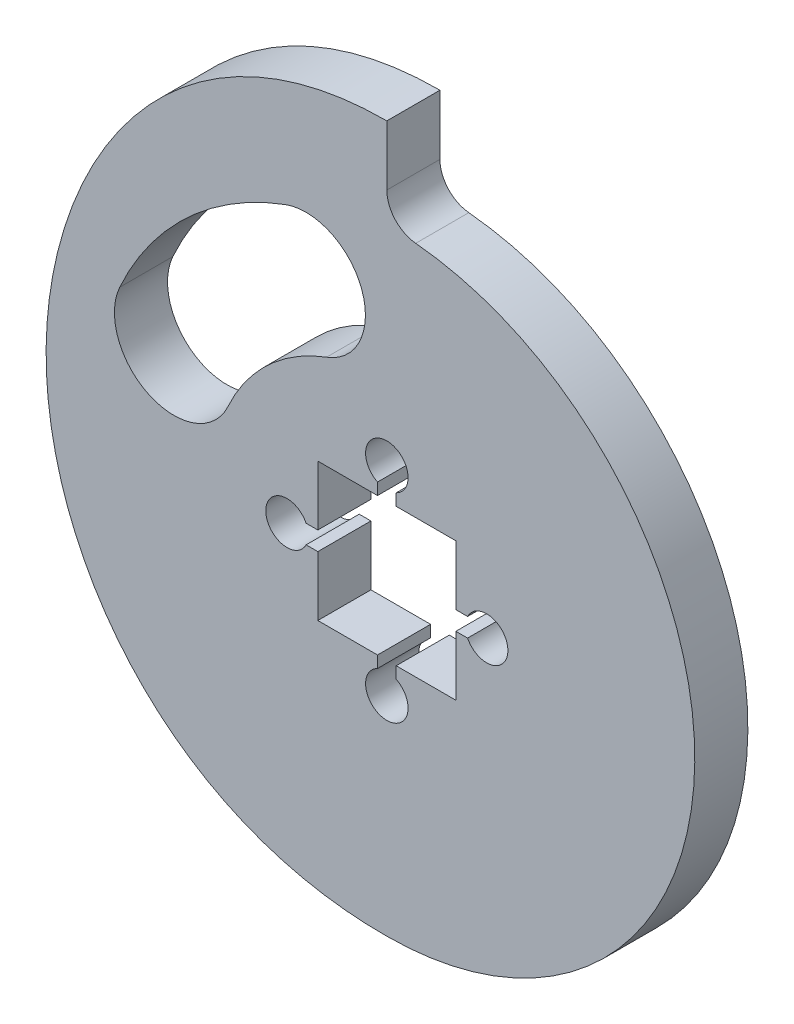
ISO-10303-21;
HEADER;
FILE_DESCRIPTION(('STEP AP214'),'2;1');
FILE_NAME('part.step','',(''),(''),'','','');
FILE_SCHEMA(('AUTOMOTIVE_DESIGN { 1 0 10303 214 1 1 1 1 }'));
ENDSEC;
DATA;
#1=APPLICATION_CONTEXT('core data for automotive mechanical design processes');
#2=APPLICATION_PROTOCOL_DEFINITION('international standard','automotive_design',2000,#1);
#3=PRODUCT_CONTEXT('',#1,'mechanical');
#4=PRODUCT('Part','Part','',(#3));
#5=PRODUCT_RELATED_PRODUCT_CATEGORY('part','',(#4));
#6=PRODUCT_DEFINITION_FORMATION('','',#4);
#7=PRODUCT_DEFINITION_CONTEXT('part definition',#1,'design');
#8=PRODUCT_DEFINITION('design','',#6,#7);
#9=PRODUCT_DEFINITION_SHAPE('','',#8);
#10=(LENGTH_UNIT() NAMED_UNIT(*) SI_UNIT(.MILLI.,.METRE.));
#11=(NAMED_UNIT(*) PLANE_ANGLE_UNIT() SI_UNIT($,.RADIAN.));
#12=(NAMED_UNIT(*) SI_UNIT($,.STERADIAN.) SOLID_ANGLE_UNIT());
#13=UNCERTAINTY_MEASURE_WITH_UNIT(LENGTH_MEASURE(1.E-05),#10,'distance_accuracy_value','');
#14=(GEOMETRIC_REPRESENTATION_CONTEXT(3) GLOBAL_UNCERTAINTY_ASSIGNED_CONTEXT((#13)) GLOBAL_UNIT_ASSIGNED_CONTEXT((#10,
#11,#12)) REPRESENTATION_CONTEXT('',''));
#15=CARTESIAN_POINT('',(0.,0.,0.));
#16=DIRECTION('',(0.,0.,1.));
#17=DIRECTION('',(1.,0.,0.));
#18=AXIS2_PLACEMENT_3D('',#15,#16,#17);
#19=CARTESIAN_POINT('',(0.,0.,6.35));
#20=DIRECTION('',(1.,0.,0.));
#21=DIRECTION('',(0.,1.,0.));
#22=AXIS2_PLACEMENT_3D('',#19,#20,#21);
#23=PLANE('',#22);
#24=DIRECTION('',(0.,-1.,0.));
#25=VECTOR('',#24,1.);
#26=CARTESIAN_POINT('',(0.,0.,6.35));
#27=LINE('',#26,#25);
#28=CARTESIAN_POINT('',(0.,47.625,6.35));
#29=VERTEX_POINT('',#28);
#30=CARTESIAN_POINT('',(0.,40.4610120980679,6.35));
#31=VERTEX_POINT('',#30);
#32=EDGE_CURVE('E323',#29,#31,#27,.T.);
#33=ORIENTED_EDGE('',*,*,#32,.T.);
#34=DIRECTION('',(0.,0.,-1.));
#35=VECTOR('',#34,1.);
#36=CARTESIAN_POINT('',(0.,40.4610120980679,6.35));
#37=LINE('',#36,#35);
#38=CARTESIAN_POINT('',(0.,40.4610120980679,0.));
#39=VERTEX_POINT('',#38);
#40=EDGE_CURVE('E506',#31,#39,#37,.T.);
#41=ORIENTED_EDGE('',*,*,#40,.T.);
#42=DIRECTION('',(0.,-1.,0.));
#43=VECTOR('',#42,1.);
#44=CARTESIAN_POINT('',(0.,0.,0.));
#45=LINE('',#44,#43);
#46=CARTESIAN_POINT('',(0.,47.625,0.));
#47=VERTEX_POINT('',#46);
#48=EDGE_CURVE('E490',#47,#39,#45,.T.);
#49=ORIENTED_EDGE('',*,*,#48,.F.);
#50=DIRECTION('',(0.,0.,-1.));
#51=VECTOR('',#50,1.);
#52=CARTESIAN_POINT('',(0.,47.625,6.35));
#53=LINE('',#52,#51);
#54=EDGE_CURVE('E504',#29,#47,#53,.T.);
#55=ORIENTED_EDGE('',*,*,#54,.F.);
#56=EDGE_LOOP('',(#33,#41,#49,#55));
#57=FACE_BOUND('',#56,.T.);
#58=ADVANCED_FACE('F43',(#57),#23,.T.);
#59=CARTESIAN_POINT('',(0.,47.625,6.35));
#60=CARTESIAN_POINT('',(-26.6001532489373,47.625,6.35));
#61=CARTESIAN_POINT('',(-56.1496420569065,-0.404637175168933,6.35));
#62=CARTESIAN_POINT('',(-24.155195679516,-36.9840787872397,6.35));
#63=CARTESIAN_POINT('',(0.,-36.83,6.35));
#64=B_SPLINE_CURVE_WITH_KNOTS('',3,(#59,#60,#61,#62,#63),.UNSPECIFIED.,.F.,.F.,(4,1,4),(0.,
0.529165326863951,1.),.UNSPECIFIED.);
#65=DIRECTION('',(0.,0.,-1.));
#66=VECTOR('',#65,1.);
#67=SURFACE_OF_LINEAR_EXTRUSION('',#64,#66);
#68=CARTESIAN_POINT('',(0.,47.625,0.));
#69=CARTESIAN_POINT('',(-26.6001532489373,47.625,0.));
#70=CARTESIAN_POINT('',(-56.1496420569065,-0.404637175168933,0.));
#71=CARTESIAN_POINT('',(-24.155195679516,-36.9840787872397,0.));
#72=CARTESIAN_POINT('',(0.,-36.83,0.));
#73=B_SPLINE_CURVE_WITH_KNOTS('',3,(#68,#69,#70,#71,#72),.UNSPECIFIED.,.F.,.F.,(4,1,4),(0.,
0.529165326863951,1.),.UNSPECIFIED.);
#74=CARTESIAN_POINT('',(0.,-36.83,0.));
#75=VERTEX_POINT('',#74);
#76=EDGE_CURVE('E492',#47,#75,#73,.T.);
#77=ORIENTED_EDGE('',*,*,#76,.T.);
#78=DIRECTION('',(0.,0.,-1.));
#79=VECTOR('',#78,1.);
#80=CARTESIAN_POINT('',(0.,-36.83,6.35));
#81=LINE('',#80,#79);
#82=CARTESIAN_POINT('',(0.,-36.83,6.35));
#83=VERTEX_POINT('',#82);
#84=EDGE_CURVE('E501',#83,#75,#81,.T.);
#85=ORIENTED_EDGE('',*,*,#84,.F.);
#86=EDGE_CURVE('E326',#29,#83,#64,.T.);
#87=ORIENTED_EDGE('',*,*,#86,.F.);
#88=ORIENTED_EDGE('',*,*,#54,.T.);
#89=EDGE_LOOP('',(#77,#85,#87,#88));
#90=FACE_BOUND('',#89,.T.);
#91=ADVANCED_FACE('F338',(#90),#67,.F.);
#92=CARTESIAN_POINT('',(0.,11.938,6.35));
#93=DIRECTION('',(0.,0.,-1.));
#94=DIRECTION('',(-1.,0.,0.));
#95=AXIS2_PLACEMENT_3D('',#92,#93,#94);
#96=CYLINDRICAL_SURFACE('',#95,2.54);
#97=CARTESIAN_POINT('',(0.,11.938,0.));
#98=DIRECTION('',(0.,0.,1.));
#99=DIRECTION('',(1.,0.,0.));
#100=AXIS2_PLACEMENT_3D('',#97,#98,#99);
#101=CIRCLE('',#100,2.54);
#102=CARTESIAN_POINT('',(1.1176,9.65708565702261,0.));
#103=VERTEX_POINT('',#102);
#104=CARTESIAN_POINT('',(-1.1176,9.65708565702261,0.));
#105=VERTEX_POINT('',#104);
#106=EDGE_CURVE('E266',#103,#105,#101,.T.);
#107=ORIENTED_EDGE('',*,*,#106,.F.);
#108=DIRECTION('',(0.,0.,-1.));
#109=VECTOR('',#108,1.);
#110=CARTESIAN_POINT('',(1.1176,9.65708565702261,6.35));
#111=LINE('',#110,#109);
#112=CARTESIAN_POINT('',(1.1176,9.65708565702261,6.35));
#113=VERTEX_POINT('',#112);
#114=EDGE_CURVE('E430',#113,#103,#111,.T.);
#115=ORIENTED_EDGE('',*,*,#114,.F.);
#116=CARTESIAN_POINT('',(0.,11.938,6.35));
#117=DIRECTION('',(0.,0.,1.));
#118=DIRECTION('',(1.,0.,0.));
#119=AXIS2_PLACEMENT_3D('',#116,#117,#118);
#120=CIRCLE('',#119,2.54);
#121=CARTESIAN_POINT('',(-1.1176,9.65708565702261,6.35));
#122=VERTEX_POINT('',#121);
#123=EDGE_CURVE('E270',#113,#122,#120,.T.);
#124=ORIENTED_EDGE('',*,*,#123,.T.);
#125=DIRECTION('',(0.,0.,-1.));
#126=VECTOR('',#125,1.);
#127=CARTESIAN_POINT('',(-1.1176,9.65708565702261,6.35));
#128=LINE('',#127,#126);
#129=EDGE_CURVE('E432',#122,#105,#128,.T.);
#130=ORIENTED_EDGE('',*,*,#129,.T.);
#131=EDGE_LOOP('',(#107,#115,#124,#130));
#132=FACE_BOUND('',#131,.T.);
#133=ADVANCED_FACE('F342',(#132),#96,.F.);
#134=CARTESIAN_POINT('',(1.1176,0.,6.35));
#135=DIRECTION('',(1.,0.,0.));
#136=DIRECTION('',(0.,0.,-1.));
#137=AXIS2_PLACEMENT_3D('',#134,#135,#136);
#138=PLANE('',#137);
#139=DIRECTION('',(0.,-1.,0.));
#140=VECTOR('',#139,1.);
#141=CARTESIAN_POINT('',(1.1176,0.,0.));
#142=LINE('',#141,#140);
#143=CARTESIAN_POINT('',(1.1176,8.255,0.));
#144=VERTEX_POINT('',#143);
#145=EDGE_CURVE('E436',#103,#144,#142,.T.);
#146=ORIENTED_EDGE('',*,*,#145,.T.);
#147=DIRECTION('',(0.,0.,-1.));
#148=VECTOR('',#147,1.);
#149=CARTESIAN_POINT('',(1.1176,8.255,6.35));
#150=LINE('',#149,#148);
#151=CARTESIAN_POINT('',(1.1176,8.255,6.35));
#152=VERTEX_POINT('',#151);
#153=EDGE_CURVE('E544',#152,#144,#150,.T.);
#154=ORIENTED_EDGE('',*,*,#153,.F.);
#155=DIRECTION('',(0.,-1.,0.));
#156=VECTOR('',#155,1.);
#157=CARTESIAN_POINT('',(1.1176,0.,6.35));
#158=LINE('',#157,#156);
#159=EDGE_CURVE('E273',#113,#152,#158,.T.);
#160=ORIENTED_EDGE('',*,*,#159,.F.);
#161=ORIENTED_EDGE('',*,*,#114,.T.);
#162=EDGE_LOOP('',(#146,#154,#160,#161));
#163=FACE_BOUND('',#162,.T.);
#164=ADVANCED_FACE('F420',(#163),#138,.F.);
#165=CARTESIAN_POINT('',(0.,8.255,6.35));
#166=DIRECTION('',(0.,1.,0.));
#167=DIRECTION('',(-1.,0.,0.));
#168=AXIS2_PLACEMENT_3D('',#165,#166,#167);
#169=PLANE('',#168);
#170=DIRECTION('',(1.,0.,0.));
#171=VECTOR('',#170,1.);
#172=CARTESIAN_POINT('',(0.,8.255,0.));
#173=LINE('',#172,#171);
#174=CARTESIAN_POINT('',(8.255,8.255,0.));
#175=VERTEX_POINT('',#174);
#176=EDGE_CURVE('E437',#144,#175,#173,.T.);
#177=ORIENTED_EDGE('',*,*,#176,.T.);
#178=DIRECTION('',(0.,0.,-1.));
#179=VECTOR('',#178,1.);
#180=CARTESIAN_POINT('',(8.255,8.255,6.35));
#181=LINE('',#180,#179);
#182=CARTESIAN_POINT('',(8.255,8.255,6.35));
#183=VERTEX_POINT('',#182);
#184=EDGE_CURVE('E541',#183,#175,#181,.T.);
#185=ORIENTED_EDGE('',*,*,#184,.F.);
#186=DIRECTION('',(1.,0.,0.));
#187=VECTOR('',#186,1.);
#188=CARTESIAN_POINT('',(0.,8.255,6.35));
#189=LINE('',#188,#187);
#190=EDGE_CURVE('E276',#152,#183,#189,.T.);
#191=ORIENTED_EDGE('',*,*,#190,.F.);
#192=ORIENTED_EDGE('',*,*,#153,.T.);
#193=EDGE_LOOP('',(#177,#185,#191,#192));
#194=FACE_BOUND('',#193,.T.);
#195=ADVANCED_FACE('F416',(#194),#169,.F.);
#196=CARTESIAN_POINT('',(8.255,0.,6.35));
#197=DIRECTION('',(1.,0.,0.));
#198=DIRECTION('',(0.,1.,0.));
#199=AXIS2_PLACEMENT_3D('',#196,#197,#198);
#200=PLANE('',#199);
#201=DIRECTION('',(0.,-1.,0.));
#202=VECTOR('',#201,1.);
#203=CARTESIAN_POINT('',(8.255,0.,0.));
#204=LINE('',#203,#202);
#205=CARTESIAN_POINT('',(8.255,1.1176,0.));
#206=VERTEX_POINT('',#205);
#207=EDGE_CURVE('E441',#175,#206,#204,.T.);
#208=ORIENTED_EDGE('',*,*,#207,.T.);
#209=DIRECTION('',(0.,0.,-1.));
#210=VECTOR('',#209,1.);
#211=CARTESIAN_POINT('',(8.255,1.1176,6.35));
#212=LINE('',#211,#210);
#213=CARTESIAN_POINT('',(8.255,1.1176,6.35));
#214=VERTEX_POINT('',#213);
#215=EDGE_CURVE('E538',#214,#206,#212,.T.);
#216=ORIENTED_EDGE('',*,*,#215,.F.);
#217=DIRECTION('',(0.,-1.,0.));
#218=VECTOR('',#217,1.);
#219=CARTESIAN_POINT('',(8.255,0.,6.35));
#220=LINE('',#219,#218);
#221=EDGE_CURVE('E278',#183,#214,#220,.T.);
#222=ORIENTED_EDGE('',*,*,#221,.F.);
#223=ORIENTED_EDGE('',*,*,#184,.T.);
#224=EDGE_LOOP('',(#208,#216,#222,#223));
#225=FACE_BOUND('',#224,.T.);
#226=ADVANCED_FACE('F412',(#225),#200,.F.);
#227=CARTESIAN_POINT('',(0.,1.1176,6.35));
#228=DIRECTION('',(0.,1.,0.));
#229=DIRECTION('',(0.,0.,1.));
#230=AXIS2_PLACEMENT_3D('',#227,#228,#229);
#231=PLANE('',#230);
#232=DIRECTION('',(1.,0.,0.));
#233=VECTOR('',#232,1.);
#234=CARTESIAN_POINT('',(0.,1.1176,0.));
#235=LINE('',#234,#233);
#236=CARTESIAN_POINT('',(9.6570856570226,1.1176,0.));
#237=VERTEX_POINT('',#236);
#238=EDGE_CURVE('E443',#206,#237,#235,.T.);
#239=ORIENTED_EDGE('',*,*,#238,.T.);
#240=DIRECTION('',(0.,0.,-1.));
#241=VECTOR('',#240,1.);
#242=CARTESIAN_POINT('',(9.6570856570226,1.1176,6.35));
#243=LINE('',#242,#241);
#244=CARTESIAN_POINT('',(9.6570856570226,1.1176,6.35));
#245=VERTEX_POINT('',#244);
#246=EDGE_CURVE('E536',#245,#237,#243,.T.);
#247=ORIENTED_EDGE('',*,*,#246,.F.);
#248=DIRECTION('',(1.,0.,0.));
#249=VECTOR('',#248,1.);
#250=CARTESIAN_POINT('',(0.,1.1176,6.35));
#251=LINE('',#250,#249);
#252=EDGE_CURVE('E280',#214,#245,#251,.T.);
#253=ORIENTED_EDGE('',*,*,#252,.F.);
#254=ORIENTED_EDGE('',*,*,#215,.T.);
#255=EDGE_LOOP('',(#239,#247,#253,#254));
#256=FACE_BOUND('',#255,.T.);
#257=ADVANCED_FACE('F408',(#256),#231,.F.);
#258=CARTESIAN_POINT('',(11.938,0.,6.35));
#259=DIRECTION('',(0.,0.,-1.));
#260=DIRECTION('',(-1.,0.,0.));
#261=AXIS2_PLACEMENT_3D('',#258,#259,#260);
#262=CYLINDRICAL_SURFACE('',#261,2.54);
#263=CARTESIAN_POINT('',(11.938,0.,0.));
#264=DIRECTION('',(0.,0.,1.));
#265=DIRECTION('',(1.,0.,0.));
#266=AXIS2_PLACEMENT_3D('',#263,#264,#265);
#267=CIRCLE('',#266,2.54);
#268=CARTESIAN_POINT('',(9.6570856570226,-1.1176,0.));
#269=VERTEX_POINT('',#268);
#270=EDGE_CURVE('E446',#269,#237,#267,.T.);
#271=ORIENTED_EDGE('',*,*,#270,.F.);
#272=DIRECTION('',(0.,0.,-1.));
#273=VECTOR('',#272,1.);
#274=CARTESIAN_POINT('',(9.6570856570226,-1.1176,6.35));
#275=LINE('',#274,#273);
#276=CARTESIAN_POINT('',(9.6570856570226,-1.1176,6.35));
#277=VERTEX_POINT('',#276);
#278=EDGE_CURVE('E534',#277,#269,#275,.T.);
#279=ORIENTED_EDGE('',*,*,#278,.F.);
#280=CARTESIAN_POINT('',(11.938,0.,6.35));
#281=DIRECTION('',(0.,0.,1.));
#282=DIRECTION('',(1.,0.,0.));
#283=AXIS2_PLACEMENT_3D('',#280,#281,#282);
#284=CIRCLE('',#283,2.54);
#285=EDGE_CURVE('E282',#277,#245,#284,.T.);
#286=ORIENTED_EDGE('',*,*,#285,.T.);
#287=ORIENTED_EDGE('',*,*,#246,.T.);
#288=EDGE_LOOP('',(#271,#279,#286,#287));
#289=FACE_BOUND('',#288,.T.);
#290=ADVANCED_FACE('F404',(#289),#262,.F.);
#291=CARTESIAN_POINT('',(0.,-1.11759999999999,6.35));
#292=DIRECTION('',(0.,1.,0.));
#293=DIRECTION('',(-1.,0.,0.));
#294=AXIS2_PLACEMENT_3D('',#291,#292,#293);
#295=PLANE('',#294);
#296=DIRECTION('',(1.,0.,0.));
#297=VECTOR('',#296,1.);
#298=CARTESIAN_POINT('',(0.,-1.11759999999999,0.));
#299=LINE('',#298,#297);
#300=CARTESIAN_POINT('',(8.255,-1.1176,0.));
#301=VERTEX_POINT('',#300);
#302=EDGE_CURVE('E449',#301,#269,#299,.T.);
#303=ORIENTED_EDGE('',*,*,#302,.F.);
#304=DIRECTION('',(0.,0.,-1.));
#305=VECTOR('',#304,1.);
#306=CARTESIAN_POINT('',(8.255,-1.1176,6.35));
#307=LINE('',#306,#305);
#308=CARTESIAN_POINT('',(8.255,-1.1176,6.35));
#309=VERTEX_POINT('',#308);
#310=EDGE_CURVE('E532',#309,#301,#307,.T.);
#311=ORIENTED_EDGE('',*,*,#310,.F.);
#312=DIRECTION('',(1.,0.,0.));
#313=VECTOR('',#312,1.);
#314=CARTESIAN_POINT('',(0.,-1.11759999999999,6.35));
#315=LINE('',#314,#313);
#316=EDGE_CURVE('E285',#309,#277,#315,.T.);
#317=ORIENTED_EDGE('',*,*,#316,.T.);
#318=ORIENTED_EDGE('',*,*,#278,.T.);
#319=EDGE_LOOP('',(#303,#311,#317,#318));
#320=FACE_BOUND('',#319,.T.);
#321=ADVANCED_FACE('F400',(#320),#295,.T.);
#322=CARTESIAN_POINT('',(8.255,0.,6.35));
#323=DIRECTION('',(1.,0.,0.));
#324=DIRECTION('',(0.,1.,0.));
#325=AXIS2_PLACEMENT_3D('',#322,#323,#324);
#326=PLANE('',#325);
#327=DIRECTION('',(0.,-1.,0.));
#328=VECTOR('',#327,1.);
#329=CARTESIAN_POINT('',(8.255,0.,0.));
#330=LINE('',#329,#328);
#331=CARTESIAN_POINT('',(8.255,-8.255,0.));
#332=VERTEX_POINT('',#331);
#333=EDGE_CURVE('E452',#301,#332,#330,.T.);
#334=ORIENTED_EDGE('',*,*,#333,.T.);
#335=DIRECTION('',(0.,0.,-1.));
#336=VECTOR('',#335,1.);
#337=CARTESIAN_POINT('',(8.255,-8.255,6.35));
#338=LINE('',#337,#336);
#339=CARTESIAN_POINT('',(8.255,-8.255,6.35));
#340=VERTEX_POINT('',#339);
#341=EDGE_CURVE('E530',#340,#332,#338,.T.);
#342=ORIENTED_EDGE('',*,*,#341,.F.);
#343=DIRECTION('',(0.,-1.,0.));
#344=VECTOR('',#343,1.);
#345=CARTESIAN_POINT('',(8.255,0.,6.35));
#346=LINE('',#345,#344);
#347=EDGE_CURVE('E288',#309,#340,#346,.T.);
#348=ORIENTED_EDGE('',*,*,#347,.F.);
#349=ORIENTED_EDGE('',*,*,#310,.T.);
#350=EDGE_LOOP('',(#334,#342,#348,#349));
#351=FACE_BOUND('',#350,.T.);
#352=ADVANCED_FACE('F396',(#351),#326,.F.);
#353=CARTESIAN_POINT('',(0.,-8.255,6.35));
#354=DIRECTION('',(0.,1.,0.));
#355=DIRECTION('',(-1.,0.,0.));
#356=AXIS2_PLACEMENT_3D('',#353,#354,#355);
#357=PLANE('',#356);
#358=DIRECTION('',(1.,0.,0.));
#359=VECTOR('',#358,1.);
#360=CARTESIAN_POINT('',(0.,-8.255,0.));
#361=LINE('',#360,#359);
#362=CARTESIAN_POINT('',(1.1176,-8.255,0.));
#363=VERTEX_POINT('',#362);
#364=EDGE_CURVE('E455',#363,#332,#361,.T.);
#365=ORIENTED_EDGE('',*,*,#364,.F.);
#366=DIRECTION('',(0.,0.,-1.));
#367=VECTOR('',#366,1.);
#368=CARTESIAN_POINT('',(1.1176,-8.255,6.35));
#369=LINE('',#368,#367);
#370=CARTESIAN_POINT('',(1.1176,-8.255,6.35));
#371=VERTEX_POINT('',#370);
#372=EDGE_CURVE('E528',#371,#363,#369,.T.);
#373=ORIENTED_EDGE('',*,*,#372,.F.);
#374=DIRECTION('',(1.,0.,0.));
#375=VECTOR('',#374,1.);
#376=CARTESIAN_POINT('',(0.,-8.255,6.35));
#377=LINE('',#376,#375);
#378=EDGE_CURVE('E290',#371,#340,#377,.T.);
#379=ORIENTED_EDGE('',*,*,#378,.T.);
#380=ORIENTED_EDGE('',*,*,#341,.T.);
#381=EDGE_LOOP('',(#365,#373,#379,#380));
#382=FACE_BOUND('',#381,.T.);
#383=ADVANCED_FACE('F392',(#382),#357,.T.);
#384=CARTESIAN_POINT('',(1.1176,0.,6.35));
#385=DIRECTION('',(1.,0.,0.));
#386=DIRECTION('',(0.,0.,-1.));
#387=AXIS2_PLACEMENT_3D('',#384,#385,#386);
#388=PLANE('',#387);
#389=DIRECTION('',(0.,-1.,0.));
#390=VECTOR('',#389,1.);
#391=CARTESIAN_POINT('',(1.1176,0.,0.));
#392=LINE('',#391,#390);
#393=CARTESIAN_POINT('',(1.1176,-9.65708565702261,0.));
#394=VERTEX_POINT('',#393);
#395=EDGE_CURVE('E458',#363,#394,#392,.T.);
#396=ORIENTED_EDGE('',*,*,#395,.T.);
#397=DIRECTION('',(0.,0.,-1.));
#398=VECTOR('',#397,1.);
#399=CARTESIAN_POINT('',(1.1176,-9.65708565702261,6.35));
#400=LINE('',#399,#398);
#401=CARTESIAN_POINT('',(1.1176,-9.65708565702261,6.35));
#402=VERTEX_POINT('',#401);
#403=EDGE_CURVE('E526',#402,#394,#400,.T.);
#404=ORIENTED_EDGE('',*,*,#403,.F.);
#405=DIRECTION('',(0.,-1.,0.));
#406=VECTOR('',#405,1.);
#407=CARTESIAN_POINT('',(1.1176,0.,6.35));
#408=LINE('',#407,#406);
#409=EDGE_CURVE('E293',#371,#402,#408,.T.);
#410=ORIENTED_EDGE('',*,*,#409,.F.);
#411=ORIENTED_EDGE('',*,*,#372,.T.);
#412=EDGE_LOOP('',(#396,#404,#410,#411));
#413=FACE_BOUND('',#412,.T.);
#414=ADVANCED_FACE('F388',(#413),#388,.F.);
#415=CARTESIAN_POINT('',(0.,-11.938,6.35));
#416=DIRECTION('',(0.,0.,-1.));
#417=DIRECTION('',(-1.,0.,0.));
#418=AXIS2_PLACEMENT_3D('',#415,#416,#417);
#419=CYLINDRICAL_SURFACE('',#418,2.54);
#420=CARTESIAN_POINT('',(0.,-11.938,0.));
#421=DIRECTION('',(0.,0.,1.));
#422=DIRECTION('',(1.,0.,0.));
#423=AXIS2_PLACEMENT_3D('',#420,#421,#422);
#424=CIRCLE('',#423,2.54);
#425=CARTESIAN_POINT('',(-1.1176,-9.65708565702261,0.));
#426=VERTEX_POINT('',#425);
#427=EDGE_CURVE('E461',#426,#394,#424,.T.);
#428=ORIENTED_EDGE('',*,*,#427,.F.);
#429=DIRECTION('',(0.,0.,-1.));
#430=VECTOR('',#429,1.);
#431=CARTESIAN_POINT('',(-1.1176,-9.65708565702261,6.35));
#432=LINE('',#431,#430);
#433=CARTESIAN_POINT('',(-1.1176,-9.65708565702261,6.35));
#434=VERTEX_POINT('',#433);
#435=EDGE_CURVE('E524',#434,#426,#432,.T.);
#436=ORIENTED_EDGE('',*,*,#435,.F.);
#437=CARTESIAN_POINT('',(0.,-11.938,6.35));
#438=DIRECTION('',(0.,0.,1.));
#439=DIRECTION('',(1.,0.,0.));
#440=AXIS2_PLACEMENT_3D('',#437,#438,#439);
#441=CIRCLE('',#440,2.54);
#442=EDGE_CURVE('E295',#434,#402,#441,.T.);
#443=ORIENTED_EDGE('',*,*,#442,.T.);
#444=ORIENTED_EDGE('',*,*,#403,.T.);
#445=EDGE_LOOP('',(#428,#436,#443,#444));
#446=FACE_BOUND('',#445,.T.);
#447=ADVANCED_FACE('F384',(#446),#419,.F.);
#448=CARTESIAN_POINT('',(-1.1176,0.,6.35));
#449=DIRECTION('',(1.,0.,0.));
#450=DIRECTION('',(0.,1.,0.));
#451=AXIS2_PLACEMENT_3D('',#448,#449,#450);
#452=PLANE('',#451);
#453=DIRECTION('',(0.,-1.,0.));
#454=VECTOR('',#453,1.);
#455=CARTESIAN_POINT('',(-1.1176,0.,0.));
#456=LINE('',#455,#454);
#457=CARTESIAN_POINT('',(-1.1176,-8.255,0.));
#458=VERTEX_POINT('',#457);
#459=EDGE_CURVE('E464',#458,#426,#456,.T.);
#460=ORIENTED_EDGE('',*,*,#459,.F.);
#461=DIRECTION('',(0.,0.,-1.));
#462=VECTOR('',#461,1.);
#463=CARTESIAN_POINT('',(-1.1176,-8.255,6.35));
#464=LINE('',#463,#462);
#465=CARTESIAN_POINT('',(-1.1176,-8.255,6.35));
#466=VERTEX_POINT('',#465);
#467=EDGE_CURVE('E522',#466,#458,#464,.T.);
#468=ORIENTED_EDGE('',*,*,#467,.F.);
#469=DIRECTION('',(0.,-1.,0.));
#470=VECTOR('',#469,1.);
#471=CARTESIAN_POINT('',(-1.1176,0.,6.35));
#472=LINE('',#471,#470);
#473=EDGE_CURVE('E298',#466,#434,#472,.T.);
#474=ORIENTED_EDGE('',*,*,#473,.T.);
#475=ORIENTED_EDGE('',*,*,#435,.T.);
#476=EDGE_LOOP('',(#460,#468,#474,#475));
#477=FACE_BOUND('',#476,.T.);
#478=ADVANCED_FACE('F380',(#477),#452,.T.);
#479=CARTESIAN_POINT('',(0.,-8.255,6.35));
#480=DIRECTION('',(0.,1.,0.));
#481=DIRECTION('',(-1.,0.,0.));
#482=AXIS2_PLACEMENT_3D('',#479,#480,#481);
#483=PLANE('',#482);
#484=DIRECTION('',(1.,0.,0.));
#485=VECTOR('',#484,1.);
#486=CARTESIAN_POINT('',(0.,-8.255,0.));
#487=LINE('',#486,#485);
#488=CARTESIAN_POINT('',(-8.255,-8.255,0.));
#489=VERTEX_POINT('',#488);
#490=EDGE_CURVE('E467',#489,#458,#487,.T.);
#491=ORIENTED_EDGE('',*,*,#490,.F.);
#492=DIRECTION('',(0.,0.,-1.));
#493=VECTOR('',#492,1.);
#494=CARTESIAN_POINT('',(-8.255,-8.255,6.35));
#495=LINE('',#494,#493);
#496=CARTESIAN_POINT('',(-8.255,-8.255,6.35));
#497=VERTEX_POINT('',#496);
#498=EDGE_CURVE('E520',#497,#489,#495,.T.);
#499=ORIENTED_EDGE('',*,*,#498,.F.);
#500=DIRECTION('',(1.,0.,0.));
#501=VECTOR('',#500,1.);
#502=CARTESIAN_POINT('',(0.,-8.255,6.35));
#503=LINE('',#502,#501);
#504=EDGE_CURVE('E301',#497,#466,#503,.T.);
#505=ORIENTED_EDGE('',*,*,#504,.T.);
#506=ORIENTED_EDGE('',*,*,#467,.T.);
#507=EDGE_LOOP('',(#491,#499,#505,#506));
#508=FACE_BOUND('',#507,.T.);
#509=ADVANCED_FACE('F376',(#508),#483,.T.);
#510=CARTESIAN_POINT('',(-8.255,0.,6.35));
#511=DIRECTION('',(1.,0.,0.));
#512=DIRECTION('',(0.,0.,-1.));
#513=AXIS2_PLACEMENT_3D('',#510,#511,#512);
#514=PLANE('',#513);
#515=DIRECTION('',(0.,-1.,0.));
#516=VECTOR('',#515,1.);
#517=CARTESIAN_POINT('',(-8.255,0.,0.));
#518=LINE('',#517,#516);
#519=CARTESIAN_POINT('',(-8.255,-1.1176,0.));
#520=VERTEX_POINT('',#519);
#521=EDGE_CURVE('E470',#520,#489,#518,.T.);
#522=ORIENTED_EDGE('',*,*,#521,.F.);
#523=DIRECTION('',(0.,0.,-1.));
#524=VECTOR('',#523,1.);
#525=CARTESIAN_POINT('',(-8.255,-1.1176,6.35));
#526=LINE('',#525,#524);
#527=CARTESIAN_POINT('',(-8.255,-1.1176,6.35));
#528=VERTEX_POINT('',#527);
#529=EDGE_CURVE('E518',#528,#520,#526,.T.);
#530=ORIENTED_EDGE('',*,*,#529,.F.);
#531=DIRECTION('',(0.,-1.,0.));
#532=VECTOR('',#531,1.);
#533=CARTESIAN_POINT('',(-8.255,0.,6.35));
#534=LINE('',#533,#532);
#535=EDGE_CURVE('E304',#528,#497,#534,.T.);
#536=ORIENTED_EDGE('',*,*,#535,.T.);
#537=ORIENTED_EDGE('',*,*,#498,.T.);
#538=EDGE_LOOP('',(#522,#530,#536,#537));
#539=FACE_BOUND('',#538,.T.);
#540=ADVANCED_FACE('F372',(#539),#514,.T.);
#541=CARTESIAN_POINT('',(0.,-1.1176,6.35));
#542=DIRECTION('',(0.,1.,0.));
#543=DIRECTION('',(0.,0.,1.));
#544=AXIS2_PLACEMENT_3D('',#541,#542,#543);
#545=PLANE('',#544);
#546=DIRECTION('',(1.,0.,0.));
#547=VECTOR('',#546,1.);
#548=CARTESIAN_POINT('',(0.,-1.1176,0.));
#549=LINE('',#548,#547);
#550=CARTESIAN_POINT('',(-9.6570856570226,-1.1176,0.));
#551=VERTEX_POINT('',#550);
#552=EDGE_CURVE('E473',#551,#520,#549,.T.);
#553=ORIENTED_EDGE('',*,*,#552,.F.);
#554=DIRECTION('',(0.,0.,-1.));
#555=VECTOR('',#554,1.);
#556=CARTESIAN_POINT('',(-9.6570856570226,-1.1176,6.35));
#557=LINE('',#556,#555);
#558=CARTESIAN_POINT('',(-9.6570856570226,-1.1176,6.35));
#559=VERTEX_POINT('',#558);
#560=EDGE_CURVE('E516',#559,#551,#557,.T.);
#561=ORIENTED_EDGE('',*,*,#560,.F.);
#562=DIRECTION('',(1.,0.,0.));
#563=VECTOR('',#562,1.);
#564=CARTESIAN_POINT('',(0.,-1.1176,6.35));
#565=LINE('',#564,#563);
#566=EDGE_CURVE('E307',#559,#528,#565,.T.);
#567=ORIENTED_EDGE('',*,*,#566,.T.);
#568=ORIENTED_EDGE('',*,*,#529,.T.);
#569=EDGE_LOOP('',(#553,#561,#567,#568));
#570=FACE_BOUND('',#569,.T.);
#571=ADVANCED_FACE('F368',(#570),#545,.T.);
#572=CARTESIAN_POINT('',(-11.938,0.,6.35));
#573=DIRECTION('',(0.,0.,-1.));
#574=DIRECTION('',(-1.,0.,0.));
#575=AXIS2_PLACEMENT_3D('',#572,#573,#574);
#576=CYLINDRICAL_SURFACE('',#575,2.54);
#577=CARTESIAN_POINT('',(-11.938,0.,0.));
#578=DIRECTION('',(0.,0.,1.));
#579=DIRECTION('',(1.,0.,0.));
#580=AXIS2_PLACEMENT_3D('',#577,#578,#579);
#581=CIRCLE('',#580,2.54);
#582=CARTESIAN_POINT('',(-9.6570856570226,1.1176,0.));
#583=VERTEX_POINT('',#582);
#584=EDGE_CURVE('E476',#583,#551,#581,.T.);
#585=ORIENTED_EDGE('',*,*,#584,.F.);
#586=DIRECTION('',(0.,0.,-1.));
#587=VECTOR('',#586,1.);
#588=CARTESIAN_POINT('',(-9.6570856570226,1.1176,6.35));
#589=LINE('',#588,#587);
#590=CARTESIAN_POINT('',(-9.6570856570226,1.1176,6.35));
#591=VERTEX_POINT('',#590);
#592=EDGE_CURVE('E514',#591,#583,#589,.T.);
#593=ORIENTED_EDGE('',*,*,#592,.F.);
#594=CARTESIAN_POINT('',(-11.938,0.,6.35));
#595=DIRECTION('',(0.,0.,1.));
#596=DIRECTION('',(1.,0.,0.));
#597=AXIS2_PLACEMENT_3D('',#594,#595,#596);
#598=CIRCLE('',#597,2.54);
#599=EDGE_CURVE('E310',#591,#559,#598,.T.);
#600=ORIENTED_EDGE('',*,*,#599,.T.);
#601=ORIENTED_EDGE('',*,*,#560,.T.);
#602=EDGE_LOOP('',(#585,#593,#600,#601));
#603=FACE_BOUND('',#602,.T.);
#604=ADVANCED_FACE('F364',(#603),#576,.F.);
#605=CARTESIAN_POINT('',(0.,1.1176,6.35));
#606=DIRECTION('',(0.,1.,0.));
#607=DIRECTION('',(0.,0.,1.));
#608=AXIS2_PLACEMENT_3D('',#605,#606,#607);
#609=PLANE('',#608);
#610=DIRECTION('',(1.,0.,0.));
#611=VECTOR('',#610,1.);
#612=CARTESIAN_POINT('',(0.,1.1176,0.));
#613=LINE('',#612,#611);
#614=CARTESIAN_POINT('',(-8.255,1.1176,0.));
#615=VERTEX_POINT('',#614);
#616=EDGE_CURVE('E479',#583,#615,#613,.T.);
#617=ORIENTED_EDGE('',*,*,#616,.T.);
#618=DIRECTION('',(0.,0.,-1.));
#619=VECTOR('',#618,1.);
#620=CARTESIAN_POINT('',(-8.255,1.1176,6.35));
#621=LINE('',#620,#619);
#622=CARTESIAN_POINT('',(-8.255,1.1176,6.35));
#623=VERTEX_POINT('',#622);
#624=EDGE_CURVE('E512',#623,#615,#621,.T.);
#625=ORIENTED_EDGE('',*,*,#624,.F.);
#626=DIRECTION('',(1.,0.,0.));
#627=VECTOR('',#626,1.);
#628=CARTESIAN_POINT('',(0.,1.1176,6.35));
#629=LINE('',#628,#627);
#630=EDGE_CURVE('E313',#591,#623,#629,.T.);
#631=ORIENTED_EDGE('',*,*,#630,.F.);
#632=ORIENTED_EDGE('',*,*,#592,.T.);
#633=EDGE_LOOP('',(#617,#625,#631,#632));
#634=FACE_BOUND('',#633,.T.);
#635=ADVANCED_FACE('F360',(#634),#609,.F.);
#636=CARTESIAN_POINT('',(-8.255,0.,6.35));
#637=DIRECTION('',(1.,0.,0.));
#638=DIRECTION('',(0.,0.,-1.));
#639=AXIS2_PLACEMENT_3D('',#636,#637,#638);
#640=PLANE('',#639);
#641=DIRECTION('',(0.,-1.,0.));
#642=VECTOR('',#641,1.);
#643=CARTESIAN_POINT('',(-8.255,0.,0.));
#644=LINE('',#643,#642);
#645=CARTESIAN_POINT('',(-8.255,8.255,0.));
#646=VERTEX_POINT('',#645);
#647=EDGE_CURVE('E482',#646,#615,#644,.T.);
#648=ORIENTED_EDGE('',*,*,#647,.F.);
#649=DIRECTION('',(0.,0.,-1.));
#650=VECTOR('',#649,1.);
#651=CARTESIAN_POINT('',(-8.255,8.255,6.35));
#652=LINE('',#651,#650);
#653=CARTESIAN_POINT('',(-8.255,8.255,6.35));
#654=VERTEX_POINT('',#653);
#655=EDGE_CURVE('E510',#654,#646,#652,.T.);
#656=ORIENTED_EDGE('',*,*,#655,.F.);
#657=DIRECTION('',(0.,-1.,0.));
#658=VECTOR('',#657,1.);
#659=CARTESIAN_POINT('',(-8.255,0.,6.35));
#660=LINE('',#659,#658);
#661=EDGE_CURVE('E315',#654,#623,#660,.T.);
#662=ORIENTED_EDGE('',*,*,#661,.T.);
#663=ORIENTED_EDGE('',*,*,#624,.T.);
#664=EDGE_LOOP('',(#648,#656,#662,#663));
#665=FACE_BOUND('',#664,.T.);
#666=ADVANCED_FACE('F356',(#665),#640,.T.);
#667=CARTESIAN_POINT('',(0.,8.255,6.35));
#668=DIRECTION('',(0.,1.,0.));
#669=DIRECTION('',(-1.,0.,0.));
#670=AXIS2_PLACEMENT_3D('',#667,#668,#669);
#671=PLANE('',#670);
#672=DIRECTION('',(1.,0.,0.));
#673=VECTOR('',#672,1.);
#674=CARTESIAN_POINT('',(0.,8.255,0.));
#675=LINE('',#674,#673);
#676=CARTESIAN_POINT('',(-1.1176,8.255,0.));
#677=VERTEX_POINT('',#676);
#678=EDGE_CURVE('E485',#646,#677,#675,.T.);
#679=ORIENTED_EDGE('',*,*,#678,.T.);
#680=DIRECTION('',(0.,0.,-1.));
#681=VECTOR('',#680,1.);
#682=CARTESIAN_POINT('',(-1.1176,8.255,6.35));
#683=LINE('',#682,#681);
#684=CARTESIAN_POINT('',(-1.1176,8.255,6.35));
#685=VERTEX_POINT('',#684);
#686=EDGE_CURVE('E508',#685,#677,#683,.T.);
#687=ORIENTED_EDGE('',*,*,#686,.F.);
#688=DIRECTION('',(1.,0.,0.));
#689=VECTOR('',#688,1.);
#690=CARTESIAN_POINT('',(0.,8.255,6.35));
#691=LINE('',#690,#689);
#692=EDGE_CURVE('E318',#654,#685,#691,.T.);
#693=ORIENTED_EDGE('',*,*,#692,.F.);
#694=ORIENTED_EDGE('',*,*,#655,.T.);
#695=EDGE_LOOP('',(#679,#687,#693,#694));
#696=FACE_BOUND('',#695,.T.);
#697=ADVANCED_FACE('F352',(#696),#671,.F.);
#698=CARTESIAN_POINT('',(-1.1176,0.,6.35));
#699=DIRECTION('',(1.,0.,0.));
#700=DIRECTION('',(0.,0.,-1.));
#701=AXIS2_PLACEMENT_3D('',#698,#699,#700);
#702=PLANE('',#701);
#703=DIRECTION('',(0.,-1.,0.));
#704=VECTOR('',#703,1.);
#705=CARTESIAN_POINT('',(-1.1176,0.,0.));
#706=LINE('',#705,#704);
#707=EDGE_CURVE('E488',#105,#677,#706,.T.);
#708=ORIENTED_EDGE('',*,*,#707,.F.);
#709=ORIENTED_EDGE('',*,*,#129,.F.);
#710=DIRECTION('',(0.,-1.,0.));
#711=VECTOR('',#710,1.);
#712=CARTESIAN_POINT('',(-1.1176,0.,6.35));
#713=LINE('',#712,#711);
#714=EDGE_CURVE('E320',#122,#685,#713,.T.);
#715=ORIENTED_EDGE('',*,*,#714,.T.);
#716=ORIENTED_EDGE('',*,*,#686,.T.);
#717=EDGE_LOOP('',(#708,#709,#715,#716));
#718=FACE_BOUND('',#717,.T.);
#719=ADVANCED_FACE('F349',(#718),#702,.T.);
#720=CARTESIAN_POINT('',(0.,0.,6.35));
#721=DIRECTION('',(0.,0.,-1.));
#722=DIRECTION('',(-1.,0.,0.));
#723=AXIS2_PLACEMENT_3D('',#720,#721,#722);
#724=CYLINDRICAL_SURFACE('',#723,36.83);
#725=CARTESIAN_POINT('',(0.,0.,0.));
#726=DIRECTION('',(0.,0.,1.));
#727=DIRECTION('',(1.,0.,0.));
#728=AXIS2_PLACEMENT_3D('',#725,#726,#727);
#729=CIRCLE('',#728,36.83);
#730=CARTESIAN_POINT('',(3.4528125,36.6677922138741,0.));
#731=VERTEX_POINT('',#730);
#732=EDGE_CURVE('E274',#75,#731,#729,.T.);
#733=ORIENTED_EDGE('',*,*,#732,.T.);
#734=DIRECTION('',(0.,0.,-1.));
#735=VECTOR('',#734,1.);
#736=CARTESIAN_POINT('',(3.4528125,36.6677922138741,6.35));
#737=LINE('',#736,#735);
#738=CARTESIAN_POINT('',(3.4528125,36.6677922138741,6.35));
#739=VERTEX_POINT('',#738);
#740=EDGE_CURVE('E58',#731,#739,#737,.F.);
#741=ORIENTED_EDGE('',*,*,#740,.T.);
#742=CARTESIAN_POINT('',(0.,0.,6.35));
#743=DIRECTION('',(0.,0.,1.));
#744=DIRECTION('',(1.,0.,0.));
#745=AXIS2_PLACEMENT_3D('',#742,#743,#744);
#746=CIRCLE('',#745,36.83);
#747=EDGE_CURVE('E332',#83,#739,#746,.T.);
#748=ORIENTED_EDGE('',*,*,#747,.F.);
#749=ORIENTED_EDGE('',*,*,#84,.T.);
#750=EDGE_LOOP('',(#733,#741,#748,#749));
#751=FACE_BOUND('',#750,.T.);
#752=ADVANCED_FACE('F344',(#751),#724,.T.);
#753=CARTESIAN_POINT('',(0.,0.,6.35));
#754=DIRECTION('',(0.,0.,1.));
#755=DIRECTION('',(1.,0.,0.));
#756=AXIS2_PLACEMENT_3D('',#753,#754,#755);
#757=PLANE('',#756);
#758=CARTESIAN_POINT('',(-9.67392506816292,26.2118059998843,6.35));
#759=DIRECTION('',(0.,0.,1.));
#760=DIRECTION('',(1.,0.,0.));
#761=AXIS2_PLACEMENT_3D('',#758,#759,#760);
#762=CIRCLE('',#761,7.112);
#763=CARTESIAN_POINT('',(-7.21147141444872,19.5397099271865,6.35));
#764=VERTEX_POINT('',#763);
#765=CARTESIAN_POINT('',(-12.1363787218771,32.8839020725821,6.35));
#766=VERTEX_POINT('',#765);
#767=EDGE_CURVE('E233',#764,#766,#762,.T.);
#768=ORIENTED_EDGE('',*,*,#767,.F.);
#769=CARTESIAN_POINT('',(0.,0.,6.35));
#770=DIRECTION('',(0.,0.,-1.));
#771=DIRECTION('',(1.,0.,0.));
#772=AXIS2_PLACEMENT_3D('',#769,#770,#771);
#773=CIRCLE('',#772,20.828);
#774=CARTESIAN_POINT('',(-18.9848473252049,8.56628017512035,6.35));
#775=VERTEX_POINT('',#774);
#776=EDGE_CURVE('E251',#775,#764,#773,.T.);
#777=ORIENTED_EDGE('',*,*,#776,.F.);
#778=CARTESIAN_POINT('',(-25.4674781191773,11.4913514544297,6.35));
#779=DIRECTION('',(0.,0.,1.));
#780=DIRECTION('',(1.,0.,0.));
#781=AXIS2_PLACEMENT_3D('',#778,#779,#780);
#782=CIRCLE('',#781,7.112);
#783=CARTESIAN_POINT('',(-31.9501089131497,14.4164227337391,6.35));
#784=VERTEX_POINT('',#783);
#785=EDGE_CURVE('E254',#784,#775,#782,.T.);
#786=ORIENTED_EDGE('',*,*,#785,.F.);
#787=CARTESIAN_POINT('',(0.,0.,6.35));
#788=DIRECTION('',(0.,0.,1.));
#789=DIRECTION('',(1.,0.,0.));
#790=AXIS2_PLACEMENT_3D('',#787,#788,#789);
#791=CIRCLE('',#790,35.052);
#792=EDGE_CURVE('E260',#766,#784,#791,.T.);
#793=ORIENTED_EDGE('',*,*,#792,.F.);
#794=EDGE_LOOP('',(#768,#777,#786,#793));
#795=FACE_BOUND('',#794,.T.);
#796=ORIENTED_EDGE('',*,*,#123,.F.);
#797=ORIENTED_EDGE('',*,*,#159,.T.);
#798=ORIENTED_EDGE('',*,*,#190,.T.);
#799=ORIENTED_EDGE('',*,*,#221,.T.);
#800=ORIENTED_EDGE('',*,*,#252,.T.);
#801=ORIENTED_EDGE('',*,*,#285,.F.);
#802=ORIENTED_EDGE('',*,*,#316,.F.);
#803=ORIENTED_EDGE('',*,*,#347,.T.);
#804=ORIENTED_EDGE('',*,*,#378,.F.);
#805=ORIENTED_EDGE('',*,*,#409,.T.);
#806=ORIENTED_EDGE('',*,*,#442,.F.);
#807=ORIENTED_EDGE('',*,*,#473,.F.);
#808=ORIENTED_EDGE('',*,*,#504,.F.);
#809=ORIENTED_EDGE('',*,*,#535,.F.);
#810=ORIENTED_EDGE('',*,*,#566,.F.);
#811=ORIENTED_EDGE('',*,*,#599,.F.);
#812=ORIENTED_EDGE('',*,*,#630,.T.);
#813=ORIENTED_EDGE('',*,*,#661,.F.);
#814=ORIENTED_EDGE('',*,*,#692,.T.);
#815=ORIENTED_EDGE('',*,*,#714,.F.);
#816=EDGE_LOOP('',(#796,#797,#798,#799,#800,#801,#802,#803,#804,#805,#806,#807,#808,#809,#810,
#811,#812,#813,#814,#815));
#817=FACE_BOUND('',#816,.T.);
#818=ORIENTED_EDGE('',*,*,#32,.F.);
#819=ORIENTED_EDGE('',*,*,#86,.T.);
#820=ORIENTED_EDGE('',*,*,#747,.T.);
#821=CARTESIAN_POINT('',(3.81,40.4610120980679,6.35));
#822=DIRECTION('',(0.,0.,1.));
#823=DIRECTION('',(1.,0.,0.));
#824=AXIS2_PLACEMENT_3D('',#821,#822,#823);
#825=CIRCLE('',#824,3.81);
#826=EDGE_CURVE('E11',#739,#31,#825,.F.);
#827=ORIENTED_EDGE('',*,*,#826,.T.);
#828=EDGE_LOOP('',(#818,#819,#820,#827));
#829=FACE_BOUND('',#828,.T.);
#830=ADVANCED_FACE('F559',(#795,#817,#829),#757,.T.);
#831=CARTESIAN_POINT('',(0.,0.,0.));
#832=DIRECTION('',(0.,0.,1.));
#833=DIRECTION('',(1.,0.,0.));
#834=AXIS2_PLACEMENT_3D('',#831,#832,#833);
#835=PLANE('',#834);
#836=CARTESIAN_POINT('',(0.,0.,0.));
#837=DIRECTION('',(0.,0.,-1.));
#838=DIRECTION('',(1.,0.,0.));
#839=AXIS2_PLACEMENT_3D('',#836,#837,#838);
#840=CIRCLE('',#839,20.828);
#841=CARTESIAN_POINT('',(-18.9848473252049,8.56628017512035,0.));
#842=VERTEX_POINT('',#841);
#843=CARTESIAN_POINT('',(-7.21147141444872,19.5397099271865,0.));
#844=VERTEX_POINT('',#843);
#845=EDGE_CURVE('E238',#842,#844,#840,.T.);
#846=ORIENTED_EDGE('',*,*,#845,.T.);
#847=CARTESIAN_POINT('',(-9.67392506816292,26.2118059998843,0.));
#848=DIRECTION('',(0.,0.,1.));
#849=DIRECTION('',(1.,0.,0.));
#850=AXIS2_PLACEMENT_3D('',#847,#848,#849);
#851=CIRCLE('',#850,7.112);
#852=CARTESIAN_POINT('',(-12.1363787218771,32.8839020725821,0.));
#853=VERTEX_POINT('',#852);
#854=EDGE_CURVE('E230',#844,#853,#851,.T.);
#855=ORIENTED_EDGE('',*,*,#854,.T.);
#856=CARTESIAN_POINT('',(0.,0.,0.));
#857=DIRECTION('',(0.,0.,1.));
#858=DIRECTION('',(1.,0.,0.));
#859=AXIS2_PLACEMENT_3D('',#856,#857,#858);
#860=CIRCLE('',#859,35.052);
#861=CARTESIAN_POINT('',(-31.9501089131497,14.4164227337391,0.));
#862=VERTEX_POINT('',#861);
#863=EDGE_CURVE('E242',#853,#862,#860,.T.);
#864=ORIENTED_EDGE('',*,*,#863,.T.);
#865=CARTESIAN_POINT('',(-25.4674781191773,11.4913514544297,0.));
#866=DIRECTION('',(0.,0.,1.));
#867=DIRECTION('',(1.,0.,0.));
#868=AXIS2_PLACEMENT_3D('',#865,#866,#867);
#869=CIRCLE('',#868,7.112);
#870=EDGE_CURVE('E246',#862,#842,#869,.T.);
#871=ORIENTED_EDGE('',*,*,#870,.T.);
#872=EDGE_LOOP('',(#846,#855,#864,#871));
#873=FACE_BOUND('',#872,.T.);
#874=ORIENTED_EDGE('',*,*,#106,.T.);
#875=ORIENTED_EDGE('',*,*,#707,.T.);
#876=ORIENTED_EDGE('',*,*,#678,.F.);
#877=ORIENTED_EDGE('',*,*,#647,.T.);
#878=ORIENTED_EDGE('',*,*,#616,.F.);
#879=ORIENTED_EDGE('',*,*,#584,.T.);
#880=ORIENTED_EDGE('',*,*,#552,.T.);
#881=ORIENTED_EDGE('',*,*,#521,.T.);
#882=ORIENTED_EDGE('',*,*,#490,.T.);
#883=ORIENTED_EDGE('',*,*,#459,.T.);
#884=ORIENTED_EDGE('',*,*,#427,.T.);
#885=ORIENTED_EDGE('',*,*,#395,.F.);
#886=ORIENTED_EDGE('',*,*,#364,.T.);
#887=ORIENTED_EDGE('',*,*,#333,.F.);
#888=ORIENTED_EDGE('',*,*,#302,.T.);
#889=ORIENTED_EDGE('',*,*,#270,.T.);
#890=ORIENTED_EDGE('',*,*,#238,.F.);
#891=ORIENTED_EDGE('',*,*,#207,.F.);
#892=ORIENTED_EDGE('',*,*,#176,.F.);
#893=ORIENTED_EDGE('',*,*,#145,.F.);
#894=EDGE_LOOP('',(#874,#875,#876,#877,#878,#879,#880,#881,#882,#883,#884,#885,#886,#887,#888,
#889,#890,#891,#892,#893));
#895=FACE_BOUND('',#894,.T.);
#896=ORIENTED_EDGE('',*,*,#48,.T.);
#897=CARTESIAN_POINT('',(3.81,40.4610120980679,0.));
#898=DIRECTION('',(0.,0.,1.));
#899=DIRECTION('',(1.,0.,0.));
#900=AXIS2_PLACEMENT_3D('',#897,#898,#899);
#901=CIRCLE('',#900,3.81);
#902=EDGE_CURVE('E51',#39,#731,#901,.T.);
#903=ORIENTED_EDGE('',*,*,#902,.T.);
#904=ORIENTED_EDGE('',*,*,#732,.F.);
#905=ORIENTED_EDGE('',*,*,#76,.F.);
#906=EDGE_LOOP('',(#896,#903,#904,#905));
#907=FACE_BOUND('',#906,.T.);
#908=ADVANCED_FACE('F248',(#873,#895,#907),#835,.F.);
#909=CARTESIAN_POINT('',(-9.67392506816292,26.2118059998843,0.));
#910=DIRECTION('',(0.,0.,1.));
#911=DIRECTION('',(1.,0.,0.));
#912=AXIS2_PLACEMENT_3D('',#909,#910,#911);
#913=CYLINDRICAL_SURFACE('',#912,7.112);
#914=ORIENTED_EDGE('',*,*,#767,.T.);
#915=DIRECTION('',(0.,0.,1.));
#916=VECTOR('',#915,1.);
#917=CARTESIAN_POINT('',(-12.1363787218771,32.8839020725821,0.));
#918=LINE('',#917,#916);
#919=EDGE_CURVE('E226',#853,#766,#918,.T.);
#920=ORIENTED_EDGE('',*,*,#919,.F.);
#921=ORIENTED_EDGE('',*,*,#854,.F.);
#922=DIRECTION('',(0.,0.,1.));
#923=VECTOR('',#922,1.);
#924=CARTESIAN_POINT('',(-7.21147141444872,19.5397099271865,0.));
#925=LINE('',#924,#923);
#926=EDGE_CURVE('E264',#844,#764,#925,.T.);
#927=ORIENTED_EDGE('',*,*,#926,.T.);
#928=EDGE_LOOP('',(#914,#920,#921,#927));
#929=FACE_BOUND('',#928,.T.);
#930=ADVANCED_FACE('F228',(#929),#913,.F.);
#931=CARTESIAN_POINT('',(0.,0.,0.));
#932=DIRECTION('',(0.,0.,1.));
#933=DIRECTION('',(1.,0.,0.));
#934=AXIS2_PLACEMENT_3D('',#931,#932,#933);
#935=CYLINDRICAL_SURFACE('',#934,20.828);
#936=ORIENTED_EDGE('',*,*,#776,.T.);
#937=ORIENTED_EDGE('',*,*,#926,.F.);
#938=ORIENTED_EDGE('',*,*,#845,.F.);
#939=DIRECTION('',(0.,0.,1.));
#940=VECTOR('',#939,1.);
#941=CARTESIAN_POINT('',(-18.9848473252049,8.56628017512035,0.));
#942=LINE('',#941,#940);
#943=EDGE_CURVE('E267',#842,#775,#942,.T.);
#944=ORIENTED_EDGE('',*,*,#943,.T.);
#945=EDGE_LOOP('',(#936,#937,#938,#944));
#946=FACE_BOUND('',#945,.T.);
#947=ADVANCED_FACE('F569',(#946),#935,.T.);
#948=CARTESIAN_POINT('',(-25.4674781191773,11.4913514544297,0.));
#949=DIRECTION('',(0.,0.,1.));
#950=DIRECTION('',(1.,0.,0.));
#951=AXIS2_PLACEMENT_3D('',#948,#949,#950);
#952=CYLINDRICAL_SURFACE('',#951,7.112);
#953=ORIENTED_EDGE('',*,*,#785,.T.);
#954=ORIENTED_EDGE('',*,*,#943,.F.);
#955=ORIENTED_EDGE('',*,*,#870,.F.);
#956=DIRECTION('',(0.,0.,1.));
#957=VECTOR('',#956,1.);
#958=CARTESIAN_POINT('',(-31.9501089131497,14.4164227337391,0.));
#959=LINE('',#958,#957);
#960=EDGE_CURVE('E237',#862,#784,#959,.T.);
#961=ORIENTED_EDGE('',*,*,#960,.T.);
#962=EDGE_LOOP('',(#953,#954,#955,#961));
#963=FACE_BOUND('',#962,.T.);
#964=ADVANCED_FACE('F564',(#963),#952,.F.);
#965=CARTESIAN_POINT('',(0.,0.,0.));
#966=DIRECTION('',(0.,0.,1.));
#967=DIRECTION('',(1.,0.,0.));
#968=AXIS2_PLACEMENT_3D('',#965,#966,#967);
#969=CYLINDRICAL_SURFACE('',#968,35.052);
#970=ORIENTED_EDGE('',*,*,#792,.T.);
#971=ORIENTED_EDGE('',*,*,#960,.F.);
#972=ORIENTED_EDGE('',*,*,#863,.F.);
#973=ORIENTED_EDGE('',*,*,#919,.T.);
#974=EDGE_LOOP('',(#970,#971,#972,#973));
#975=FACE_BOUND('',#974,.T.);
#976=ADVANCED_FACE('F243',(#975),#969,.F.);
#977=CARTESIAN_POINT('',(3.81,40.4610120980679,6.35));
#978=DIRECTION('',(0.,0.,-1.));
#979=DIRECTION('',(-1.,0.,0.));
#980=AXIS2_PLACEMENT_3D('',#977,#978,#979);
#981=CYLINDRICAL_SURFACE('',#980,3.81);
#982=ORIENTED_EDGE('',*,*,#826,.F.);
#983=ORIENTED_EDGE('',*,*,#740,.F.);
#984=ORIENTED_EDGE('',*,*,#902,.F.);
#985=ORIENTED_EDGE('',*,*,#40,.F.);
#986=EDGE_LOOP('',(#982,#983,#984,#985));
#987=FACE_BOUND('',#986,.T.);
#988=ADVANCED_FACE('F45',(#987),#981,.F.);
#989=CLOSED_SHELL('',(#58,#91,#133,#164,#195,#226,#257,#290,#321,#352,#383,#414,#447,#478,#509,
#540,#571,#604,#635,#666,#697,#719,#752,#830,#908,#930,#947,#964,#976,#988));
#990=MANIFOLD_SOLID_BREP('B2',#989);
#991=ADVANCED_BREP_SHAPE_REPRESENTATION('',(#18,#990),#14);
#992=SHAPE_DEFINITION_REPRESENTATION(#9,#991);
ENDSEC;
END-ISO-10303-21;
